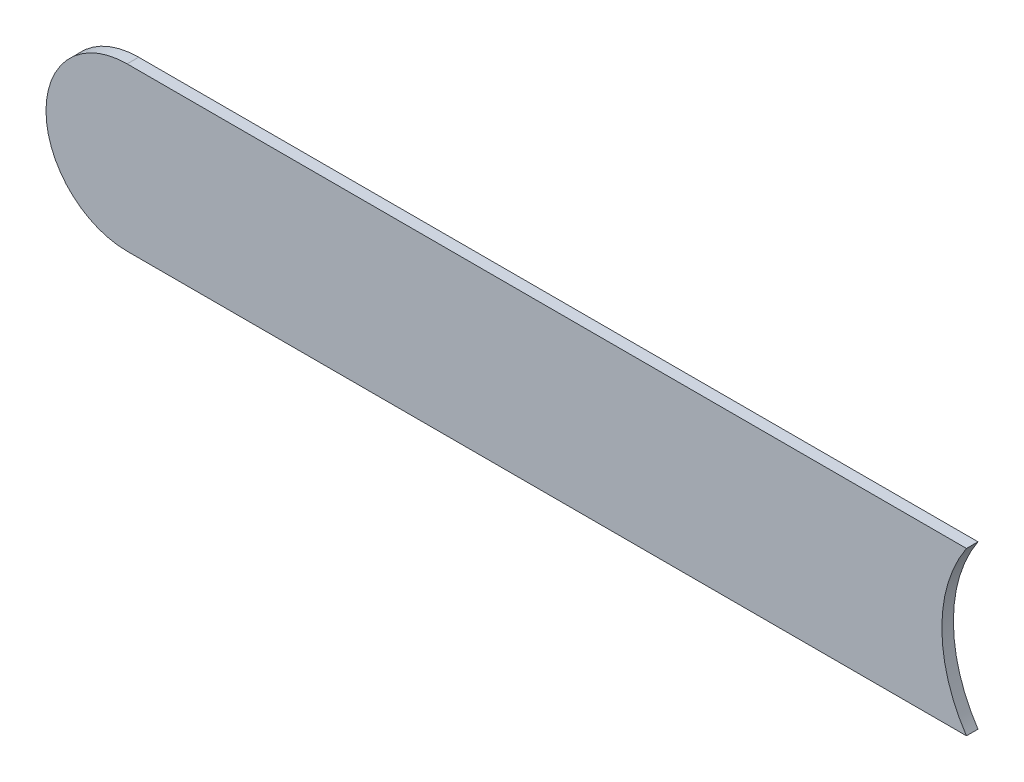
ISO-10303-21;
HEADER;
FILE_DESCRIPTION(('STEP AP214'),'2;1');
FILE_NAME('part.step','',(''),(''),'','','');
FILE_SCHEMA(('AUTOMOTIVE_DESIGN { 1 0 10303 214 1 1 1 1 }'));
ENDSEC;
DATA;
#1=APPLICATION_CONTEXT('core data for automotive mechanical design processes');
#2=APPLICATION_PROTOCOL_DEFINITION('international standard','automotive_design',2000,#1);
#3=PRODUCT_CONTEXT('',#1,'mechanical');
#4=PRODUCT('Part','Part','',(#3));
#5=PRODUCT_RELATED_PRODUCT_CATEGORY('part','',(#4));
#6=PRODUCT_DEFINITION_FORMATION('','',#4);
#7=PRODUCT_DEFINITION_CONTEXT('part definition',#1,'design');
#8=PRODUCT_DEFINITION('design','',#6,#7);
#9=PRODUCT_DEFINITION_SHAPE('','',#8);
#10=(LENGTH_UNIT() NAMED_UNIT(*) SI_UNIT(.MILLI.,.METRE.));
#11=(NAMED_UNIT(*) PLANE_ANGLE_UNIT() SI_UNIT($,.RADIAN.));
#12=(NAMED_UNIT(*) SI_UNIT($,.STERADIAN.) SOLID_ANGLE_UNIT());
#13=UNCERTAINTY_MEASURE_WITH_UNIT(LENGTH_MEASURE(1.E-05),#10,'distance_accuracy_value','');
#14=(GEOMETRIC_REPRESENTATION_CONTEXT(3) GLOBAL_UNCERTAINTY_ASSIGNED_CONTEXT((#13)) GLOBAL_UNIT_ASSIGNED_CONTEXT((#10,
#11,#12)) REPRESENTATION_CONTEXT('',''));
#15=CARTESIAN_POINT('',(0.,0.,0.));
#16=DIRECTION('',(0.,0.,1.));
#17=DIRECTION('',(1.,0.,0.));
#18=AXIS2_PLACEMENT_3D('',#15,#16,#17);
#19=CARTESIAN_POINT('',(114.33998722,79.3100141,0.));
#20=DIRECTION('',(0.,1.,0.));
#21=DIRECTION('',(1.,0.,0.));
#22=AXIS2_PLACEMENT_3D('',#19,#20,#21);
#23=PLANE('',#22);
#24=DIRECTION('',(1.,0.,0.));
#25=VECTOR('',#24,1.);
#26=CARTESIAN_POINT('',(114.33998722,79.3100141,0.03556));
#27=LINE('',#26,#25);
#28=CARTESIAN_POINT('',(114.33998722,79.3100141,0.03556));
#29=VERTEX_POINT('',#28);
#30=CARTESIAN_POINT('',(116.925829009654,79.3100141,0.03556));
#31=VERTEX_POINT('',#30);
#32=EDGE_CURVE('E11',#29,#31,#27,.T.);
#33=ORIENTED_EDGE('',*,*,#32,.F.);
#34=DIRECTION('',(0.,0.,1.));
#35=VECTOR('',#34,1.);
#36=CARTESIAN_POINT('',(114.33998722,79.3100141,0.));
#37=LINE('',#36,#35);
#38=CARTESIAN_POINT('',(114.33998722,79.3100141,0.));
#39=VERTEX_POINT('',#38);
#40=EDGE_CURVE('E24',#39,#29,#37,.T.);
#41=ORIENTED_EDGE('',*,*,#40,.F.);
#42=DIRECTION('',(1.,0.,0.));
#43=VECTOR('',#42,1.);
#44=CARTESIAN_POINT('',(114.33998722,79.3100141,0.));
#45=LINE('',#44,#43);
#46=CARTESIAN_POINT('',(116.925829009654,79.3100141,0.));
#47=VERTEX_POINT('',#46);
#48=EDGE_CURVE('E75',#39,#47,#45,.T.);
#49=ORIENTED_EDGE('',*,*,#48,.T.);
#50=DIRECTION('',(0.,0.,1.));
#51=VECTOR('',#50,1.);
#52=CARTESIAN_POINT('',(116.925829009654,79.3100141,0.));
#53=LINE('',#52,#51);
#54=EDGE_CURVE('E37',#47,#31,#53,.T.);
#55=ORIENTED_EDGE('',*,*,#54,.T.);
#56=EDGE_LOOP('',(#33,#41,#49,#55));
#57=FACE_BOUND('',#56,.T.);
#58=ADVANCED_FACE('F17',(#57),#23,.F.);
#59=CARTESIAN_POINT('',(117.299994,79.5600136,0.));
#60=DIRECTION('',(0.,0.,-1.));
#61=DIRECTION('',(1.,0.,0.));
#62=AXIS2_PLACEMENT_3D('',#59,#60,#61);
#63=CYLINDRICAL_SURFACE('',#62,0.4499991);
#64=DIRECTION('',(0.,0.,1.));
#65=VECTOR('',#64,1.);
#66=CARTESIAN_POINT('',(116.925829009654,79.8100131,0.));
#67=LINE('',#66,#65);
#68=CARTESIAN_POINT('',(116.925829009654,79.8100131,0.));
#69=VERTEX_POINT('',#68);
#70=CARTESIAN_POINT('',(116.925829009654,79.8100131,0.03556));
#71=VERTEX_POINT('',#70);
#72=EDGE_CURVE('E67',#69,#71,#67,.T.);
#73=ORIENTED_EDGE('',*,*,#72,.T.);
#74=CARTESIAN_POINT('',(117.299994,79.5600136,0.03556));
#75=DIRECTION('',(0.,0.,1.));
#76=DIRECTION('',(1.,0.,0.));
#77=AXIS2_PLACEMENT_3D('',#74,#75,#76);
#78=CIRCLE('',#77,0.4499991);
#79=EDGE_CURVE('E82',#71,#31,#78,.T.);
#80=ORIENTED_EDGE('',*,*,#79,.T.);
#81=ORIENTED_EDGE('',*,*,#54,.F.);
#82=CARTESIAN_POINT('',(117.299994,79.5600136,0.));
#83=DIRECTION('',(0.,0.,1.));
#84=DIRECTION('',(1.,0.,0.));
#85=AXIS2_PLACEMENT_3D('',#82,#83,#84);
#86=CIRCLE('',#85,0.4499991);
#87=EDGE_CURVE('E80',#69,#47,#86,.T.);
#88=ORIENTED_EDGE('',*,*,#87,.F.);
#89=EDGE_LOOP('',(#73,#80,#81,#88));
#90=FACE_BOUND('',#89,.T.);
#91=ADVANCED_FACE('F88',(#90),#63,.F.);
#92=CARTESIAN_POINT('',(116.925829009654,79.8100131,0.));
#93=DIRECTION('',(0.,-1.,0.));
#94=DIRECTION('',(-1.,0.,0.));
#95=AXIS2_PLACEMENT_3D('',#92,#93,#94);
#96=PLANE('',#95);
#97=DIRECTION('',(-1.,0.,0.));
#98=VECTOR('',#97,1.);
#99=CARTESIAN_POINT('',(117.299994,79.8100131,0.03556));
#100=LINE('',#99,#98);
#101=CARTESIAN_POINT('',(114.33998722,79.8100131,0.03556));
#102=VERTEX_POINT('',#101);
#103=EDGE_CURVE('E71',#71,#102,#100,.T.);
#104=ORIENTED_EDGE('',*,*,#103,.F.);
#105=ORIENTED_EDGE('',*,*,#72,.F.);
#106=DIRECTION('',(-1.,0.,0.));
#107=VECTOR('',#106,1.);
#108=CARTESIAN_POINT('',(117.299994,79.8100131,0.));
#109=LINE('',#108,#107);
#110=CARTESIAN_POINT('',(114.33998722,79.8100131,0.));
#111=VERTEX_POINT('',#110);
#112=EDGE_CURVE('E63',#69,#111,#109,.T.);
#113=ORIENTED_EDGE('',*,*,#112,.T.);
#114=DIRECTION('',(0.,0.,1.));
#115=VECTOR('',#114,1.);
#116=CARTESIAN_POINT('',(114.33998722,79.8100131,0.));
#117=LINE('',#116,#115);
#118=EDGE_CURVE('E53',#111,#102,#117,.T.);
#119=ORIENTED_EDGE('',*,*,#118,.T.);
#120=EDGE_LOOP('',(#104,#105,#113,#119));
#121=FACE_BOUND('',#120,.T.);
#122=ADVANCED_FACE('F66',(#121),#96,.F.);
#123=CARTESIAN_POINT('',(114.33998722,79.5600136,0.));
#124=DIRECTION('',(0.,0.,-1.));
#125=DIRECTION('',(0.,1.,0.));
#126=AXIS2_PLACEMENT_3D('',#123,#124,#125);
#127=CYLINDRICAL_SURFACE('',#126,0.249999500000001);
#128=CARTESIAN_POINT('',(114.33998722,79.5600136,0.03556));
#129=DIRECTION('',(0.,0.,1.));
#130=DIRECTION('',(0.,1.,0.));
#131=AXIS2_PLACEMENT_3D('',#128,#129,#130);
#132=CIRCLE('',#131,0.249999500000001);
#133=EDGE_CURVE('E59',#102,#29,#132,.T.);
#134=ORIENTED_EDGE('',*,*,#133,.F.);
#135=ORIENTED_EDGE('',*,*,#118,.F.);
#136=CARTESIAN_POINT('',(114.33998722,79.5600136,0.));
#137=DIRECTION('',(0.,0.,1.));
#138=DIRECTION('',(0.,1.,0.));
#139=AXIS2_PLACEMENT_3D('',#136,#137,#138);
#140=CIRCLE('',#139,0.249999500000001);
#141=EDGE_CURVE('E57',#111,#39,#140,.T.);
#142=ORIENTED_EDGE('',*,*,#141,.T.);
#143=ORIENTED_EDGE('',*,*,#40,.T.);
#144=EDGE_LOOP('',(#134,#135,#142,#143));
#145=FACE_BOUND('',#144,.T.);
#146=ADVANCED_FACE('F55',(#145),#127,.T.);
#147=CARTESIAN_POINT('',(114.33998722,79.3100141,0.));
#148=DIRECTION('',(0.,0.,-1.));
#149=DIRECTION('',(-1.,0.,0.));
#150=AXIS2_PLACEMENT_3D('',#147,#148,#149);
#151=PLANE('',#150);
#152=ORIENTED_EDGE('',*,*,#48,.F.);
#153=ORIENTED_EDGE('',*,*,#141,.F.);
#154=ORIENTED_EDGE('',*,*,#112,.F.);
#155=ORIENTED_EDGE('',*,*,#87,.T.);
#156=EDGE_LOOP('',(#152,#153,#154,#155));
#157=FACE_BOUND('',#156,.T.);
#158=ADVANCED_FACE('F74',(#157),#151,.T.);
#159=CARTESIAN_POINT('',(114.33998722,79.3100141,0.03556));
#160=DIRECTION('',(0.,0.,-1.));
#161=DIRECTION('',(-1.,0.,0.));
#162=AXIS2_PLACEMENT_3D('',#159,#160,#161);
#163=PLANE('',#162);
#164=ORIENTED_EDGE('',*,*,#133,.T.);
#165=ORIENTED_EDGE('',*,*,#32,.T.);
#166=ORIENTED_EDGE('',*,*,#79,.F.);
#167=ORIENTED_EDGE('',*,*,#103,.T.);
#168=EDGE_LOOP('',(#164,#165,#166,#167));
#169=FACE_BOUND('',#168,.T.);
#170=ADVANCED_FACE('F91',(#169),#163,.F.);
#171=CLOSED_SHELL('',(#58,#91,#122,#146,#158,#170));
#172=MANIFOLD_SOLID_BREP('B1',#171);
#173=ADVANCED_BREP_SHAPE_REPRESENTATION('',(#18,#172),#14);
#174=SHAPE_DEFINITION_REPRESENTATION(#9,#173);
ENDSEC;
END-ISO-10303-21;
